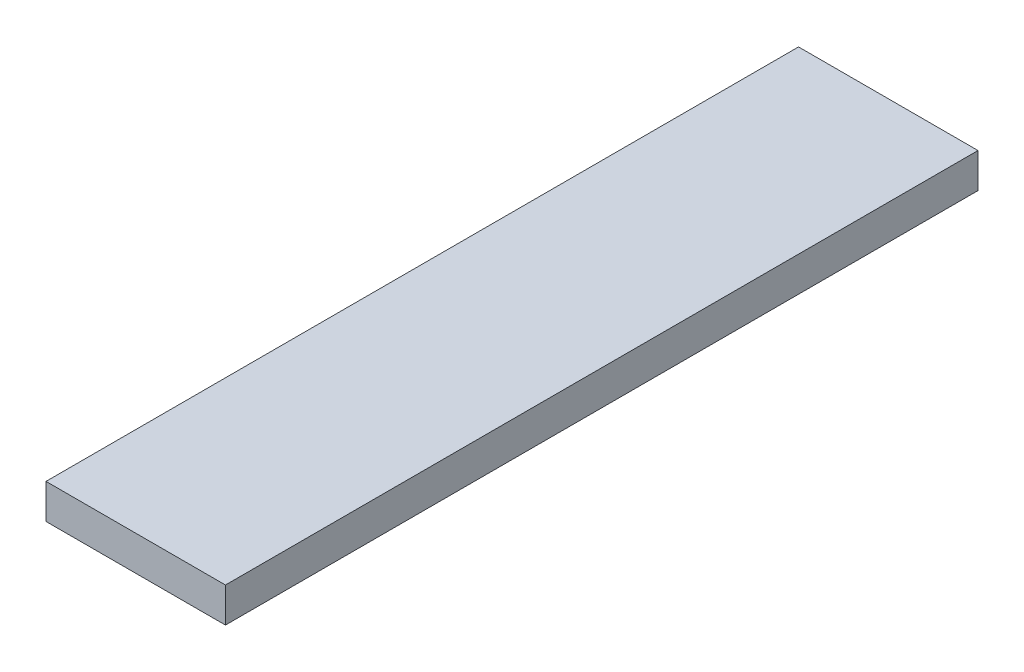
ISO-10303-21;
HEADER;
FILE_DESCRIPTION(('STEP AP214'),'2;1');
FILE_NAME('part.step','',(''),(''),'','','');
FILE_SCHEMA(('AUTOMOTIVE_DESIGN { 1 0 10303 214 1 1 1 1 }'));
ENDSEC;
DATA;
#1=APPLICATION_CONTEXT('core data for automotive mechanical design processes');
#2=APPLICATION_PROTOCOL_DEFINITION('international standard','automotive_design',2000,#1);
#3=PRODUCT_CONTEXT('',#1,'mechanical');
#4=PRODUCT('Part','Part','',(#3));
#5=PRODUCT_RELATED_PRODUCT_CATEGORY('part','',(#4));
#6=PRODUCT_DEFINITION_FORMATION('','',#4);
#7=PRODUCT_DEFINITION_CONTEXT('part definition',#1,'design');
#8=PRODUCT_DEFINITION('design','',#6,#7);
#9=PRODUCT_DEFINITION_SHAPE('','',#8);
#10=(LENGTH_UNIT() NAMED_UNIT(*) SI_UNIT(.MILLI.,.METRE.));
#11=(NAMED_UNIT(*) PLANE_ANGLE_UNIT() SI_UNIT($,.RADIAN.));
#12=(NAMED_UNIT(*) SI_UNIT($,.STERADIAN.) SOLID_ANGLE_UNIT());
#13=UNCERTAINTY_MEASURE_WITH_UNIT(LENGTH_MEASURE(1.E-05),#10,'distance_accuracy_value','');
#14=(GEOMETRIC_REPRESENTATION_CONTEXT(3) GLOBAL_UNCERTAINTY_ASSIGNED_CONTEXT((#13)) GLOBAL_UNIT_ASSIGNED_CONTEXT((#10,
#11,#12)) REPRESENTATION_CONTEXT('',''));
#15=CARTESIAN_POINT('',(0.,0.,0.));
#16=DIRECTION('',(0.,0.,1.));
#17=DIRECTION('',(1.,0.,0.));
#18=AXIS2_PLACEMENT_3D('',#15,#16,#17);
#19=CARTESIAN_POINT('',(31.,6.,0.));
#20=DIRECTION('',(0.,0.,1.));
#21=DIRECTION('',(1.,0.,0.));
#22=AXIS2_PLACEMENT_3D('',#19,#20,#21);
#23=PLANE('',#22);
#24=DIRECTION('',(-1.,0.,0.));
#25=VECTOR('',#24,1.);
#26=CARTESIAN_POINT('',(31.,0.,0.));
#27=LINE('',#26,#25);
#28=CARTESIAN_POINT('',(31.,0.,0.));
#29=VERTEX_POINT('',#28);
#30=CARTESIAN_POINT('',(0.,0.,0.));
#31=VERTEX_POINT('',#30);
#32=EDGE_CURVE('E98',#29,#31,#27,.T.);
#33=ORIENTED_EDGE('',*,*,#32,.T.);
#34=DIRECTION('',(0.,-1.,0.));
#35=VECTOR('',#34,1.);
#36=CARTESIAN_POINT('',(0.,6.,0.));
#37=LINE('',#36,#35);
#38=CARTESIAN_POINT('',(0.,6.,0.));
#39=VERTEX_POINT('',#38);
#40=EDGE_CURVE('E11',#39,#31,#37,.T.);
#41=ORIENTED_EDGE('',*,*,#40,.F.);
#42=DIRECTION('',(-1.,0.,0.));
#43=VECTOR('',#42,1.);
#44=CARTESIAN_POINT('',(31.,6.,0.));
#45=LINE('',#44,#43);
#46=CARTESIAN_POINT('',(31.,6.,0.));
#47=VERTEX_POINT('',#46);
#48=EDGE_CURVE('E86',#47,#39,#45,.T.);
#49=ORIENTED_EDGE('',*,*,#48,.F.);
#50=DIRECTION('',(0.,-1.,0.));
#51=VECTOR('',#50,1.);
#52=CARTESIAN_POINT('',(31.,6.,0.));
#53=LINE('',#52,#51);
#54=EDGE_CURVE('E94',#47,#29,#53,.T.);
#55=ORIENTED_EDGE('',*,*,#54,.T.);
#56=EDGE_LOOP('',(#33,#41,#49,#55));
#57=FACE_BOUND('',#56,.T.);
#58=ADVANCED_FACE('F35',(#57),#23,.F.);
#59=CARTESIAN_POINT('',(0.,6.,0.));
#60=DIRECTION('',(1.,0.,0.));
#61=DIRECTION('',(0.,0.,-1.));
#62=AXIS2_PLACEMENT_3D('',#59,#60,#61);
#63=PLANE('',#62);
#64=DIRECTION('',(0.,0.,1.));
#65=VECTOR('',#64,1.);
#66=CARTESIAN_POINT('',(0.,0.,0.));
#67=LINE('',#66,#65);
#68=CARTESIAN_POINT('',(0.,0.,130.));
#69=VERTEX_POINT('',#68);
#70=EDGE_CURVE('E90',#31,#69,#67,.T.);
#71=ORIENTED_EDGE('',*,*,#70,.T.);
#72=DIRECTION('',(0.,-1.,0.));
#73=VECTOR('',#72,1.);
#74=CARTESIAN_POINT('',(0.,6.,130.));
#75=LINE('',#74,#73);
#76=CARTESIAN_POINT('',(0.,6.,130.));
#77=VERTEX_POINT('',#76);
#78=EDGE_CURVE('E43',#77,#69,#75,.T.);
#79=ORIENTED_EDGE('',*,*,#78,.F.);
#80=DIRECTION('',(0.,0.,1.));
#81=VECTOR('',#80,1.);
#82=CARTESIAN_POINT('',(0.,6.,0.));
#83=LINE('',#82,#81);
#84=EDGE_CURVE('E81',#39,#77,#83,.T.);
#85=ORIENTED_EDGE('',*,*,#84,.F.);
#86=ORIENTED_EDGE('',*,*,#40,.T.);
#87=EDGE_LOOP('',(#71,#79,#85,#86));
#88=FACE_BOUND('',#87,.T.);
#89=ADVANCED_FACE('F89',(#88),#63,.F.);
#90=CARTESIAN_POINT('',(0.,6.,130.));
#91=DIRECTION('',(0.,0.,-1.));
#92=DIRECTION('',(-1.,0.,0.));
#93=AXIS2_PLACEMENT_3D('',#90,#91,#92);
#94=PLANE('',#93);
#95=DIRECTION('',(1.,0.,0.));
#96=VECTOR('',#95,1.);
#97=CARTESIAN_POINT('',(0.,0.,130.));
#98=LINE('',#97,#96);
#99=CARTESIAN_POINT('',(31.,0.,130.));
#100=VERTEX_POINT('',#99);
#101=EDGE_CURVE('E68',#69,#100,#98,.T.);
#102=ORIENTED_EDGE('',*,*,#101,.T.);
#103=DIRECTION('',(0.,-1.,0.));
#104=VECTOR('',#103,1.);
#105=CARTESIAN_POINT('',(31.,6.,130.));
#106=LINE('',#105,#104);
#107=CARTESIAN_POINT('',(31.,6.,130.));
#108=VERTEX_POINT('',#107);
#109=EDGE_CURVE('E91',#108,#100,#106,.T.);
#110=ORIENTED_EDGE('',*,*,#109,.F.);
#111=DIRECTION('',(1.,0.,0.));
#112=VECTOR('',#111,1.);
#113=CARTESIAN_POINT('',(0.,6.,130.));
#114=LINE('',#113,#112);
#115=EDGE_CURVE('E84',#77,#108,#114,.T.);
#116=ORIENTED_EDGE('',*,*,#115,.F.);
#117=ORIENTED_EDGE('',*,*,#78,.T.);
#118=EDGE_LOOP('',(#102,#110,#116,#117));
#119=FACE_BOUND('',#118,.T.);
#120=ADVANCED_FACE('F92',(#119),#94,.F.);
#121=CARTESIAN_POINT('',(31.,6.,130.));
#122=DIRECTION('',(-1.,0.,0.));
#123=DIRECTION('',(0.,0.,1.));
#124=AXIS2_PLACEMENT_3D('',#121,#122,#123);
#125=PLANE('',#124);
#126=DIRECTION('',(0.,0.,-1.));
#127=VECTOR('',#126,1.);
#128=CARTESIAN_POINT('',(31.,0.,130.));
#129=LINE('',#128,#127);
#130=EDGE_CURVE('E74',#100,#29,#129,.T.);
#131=ORIENTED_EDGE('',*,*,#130,.T.);
#132=ORIENTED_EDGE('',*,*,#54,.F.);
#133=DIRECTION('',(0.,0.,-1.));
#134=VECTOR('',#133,1.);
#135=CARTESIAN_POINT('',(31.,6.,130.));
#136=LINE('',#135,#134);
#137=EDGE_CURVE('E51',#108,#47,#136,.T.);
#138=ORIENTED_EDGE('',*,*,#137,.F.);
#139=ORIENTED_EDGE('',*,*,#109,.T.);
#140=EDGE_LOOP('',(#131,#132,#138,#139));
#141=FACE_BOUND('',#140,.T.);
#142=ADVANCED_FACE('F105',(#141),#125,.F.);
#143=CARTESIAN_POINT('',(0.,6.,0.));
#144=DIRECTION('',(0.,1.,0.));
#145=DIRECTION('',(0.,0.,1.));
#146=AXIS2_PLACEMENT_3D('',#143,#144,#145);
#147=PLANE('',#146);
#148=ORIENTED_EDGE('',*,*,#48,.T.);
#149=ORIENTED_EDGE('',*,*,#84,.T.);
#150=ORIENTED_EDGE('',*,*,#115,.T.);
#151=ORIENTED_EDGE('',*,*,#137,.T.);
#152=EDGE_LOOP('',(#148,#149,#150,#151));
#153=FACE_BOUND('',#152,.T.);
#154=ADVANCED_FACE('F82',(#153),#147,.T.);
#155=CARTESIAN_POINT('',(0.,0.,0.));
#156=DIRECTION('',(0.,1.,0.));
#157=DIRECTION('',(0.,0.,1.));
#158=AXIS2_PLACEMENT_3D('',#155,#156,#157);
#159=PLANE('',#158);
#160=ORIENTED_EDGE('',*,*,#32,.F.);
#161=ORIENTED_EDGE('',*,*,#130,.F.);
#162=ORIENTED_EDGE('',*,*,#101,.F.);
#163=ORIENTED_EDGE('',*,*,#70,.F.);
#164=EDGE_LOOP('',(#160,#161,#162,#163));
#165=FACE_BOUND('',#164,.T.);
#166=ADVANCED_FACE('F108',(#165),#159,.F.);
#167=CLOSED_SHELL('',(#58,#89,#120,#142,#154,#166));
#168=MANIFOLD_SOLID_BREP('B2',#167);
#169=ADVANCED_BREP_SHAPE_REPRESENTATION('',(#18,#168),#14);
#170=SHAPE_DEFINITION_REPRESENTATION(#9,#169);
ENDSEC;
END-ISO-10303-21;
